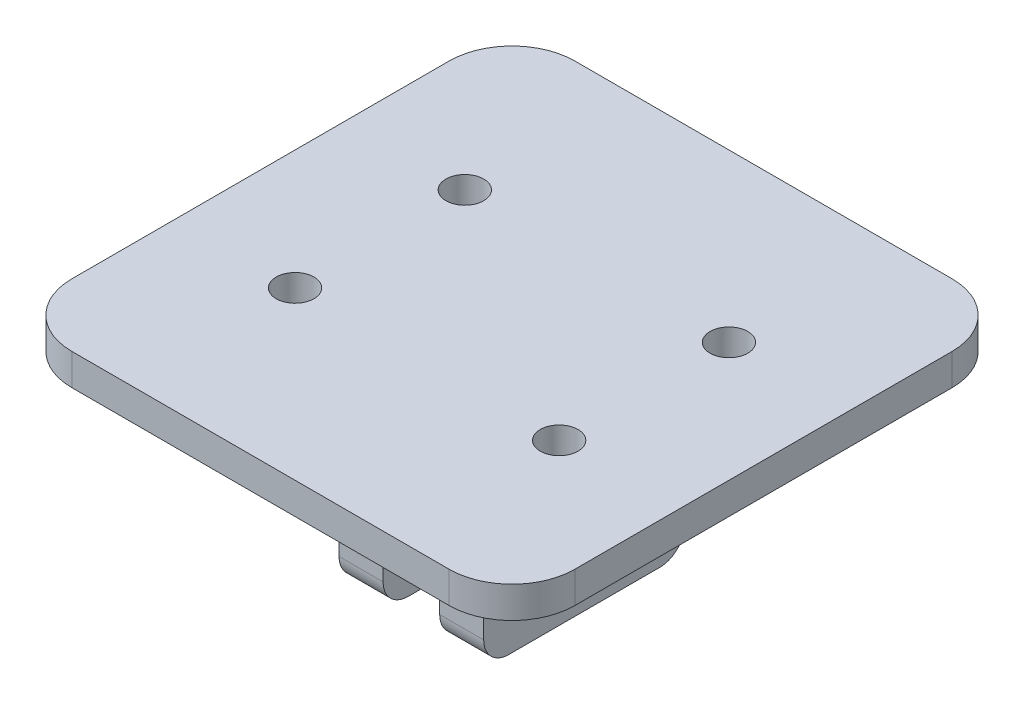
ISO-10303-21;
HEADER;
FILE_DESCRIPTION(('STEP AP214'),'2;1');
FILE_NAME('part.step','',(''),(''),'','','');
FILE_SCHEMA(('AUTOMOTIVE_DESIGN { 1 0 10303 214 1 1 1 1 }'));
ENDSEC;
DATA;
#1=APPLICATION_CONTEXT('core data for automotive mechanical design processes');
#2=APPLICATION_PROTOCOL_DEFINITION('international standard','automotive_design',2000,#1);
#3=PRODUCT_CONTEXT('',#1,'mechanical');
#4=PRODUCT('Part','Part','',(#3));
#5=PRODUCT_RELATED_PRODUCT_CATEGORY('part','',(#4));
#6=PRODUCT_DEFINITION_FORMATION('','',#4);
#7=PRODUCT_DEFINITION_CONTEXT('part definition',#1,'design');
#8=PRODUCT_DEFINITION('design','',#6,#7);
#9=PRODUCT_DEFINITION_SHAPE('','',#8);
#10=(LENGTH_UNIT() NAMED_UNIT(*) SI_UNIT(.MILLI.,.METRE.));
#11=(NAMED_UNIT(*) PLANE_ANGLE_UNIT() SI_UNIT($,.RADIAN.));
#12=(NAMED_UNIT(*) SI_UNIT($,.STERADIAN.) SOLID_ANGLE_UNIT());
#13=UNCERTAINTY_MEASURE_WITH_UNIT(LENGTH_MEASURE(1.E-05),#10,'distance_accuracy_value','');
#14=(GEOMETRIC_REPRESENTATION_CONTEXT(3) GLOBAL_UNCERTAINTY_ASSIGNED_CONTEXT((#13)) GLOBAL_UNIT_ASSIGNED_CONTEXT((#10,
#11,#12)) REPRESENTATION_CONTEXT('',''));
#15=CARTESIAN_POINT('',(0.,0.,0.));
#16=DIRECTION('',(0.,0.,1.));
#17=DIRECTION('',(1.,0.,0.));
#18=AXIS2_PLACEMENT_3D('',#15,#16,#17);
#19=CARTESIAN_POINT('',(0.,0.,0.));
#20=DIRECTION('',(0.,1.,0.));
#21=DIRECTION('',(0.,0.,1.));
#22=AXIS2_PLACEMENT_3D('',#19,#20,#21);
#23=PLANE('',#22);
#24=DIRECTION('',(0.,0.,-1.));
#25=VECTOR('',#24,1.);
#26=CARTESIAN_POINT('',(2.25,0.,8.));
#27=LINE('',#26,#25);
#28=CARTESIAN_POINT('',(2.25,0.,8.));
#29=VERTEX_POINT('',#28);
#30=CARTESIAN_POINT('',(2.25,0.,-8.00000000000001));
#31=VERTEX_POINT('',#30);
#32=EDGE_CURVE('E195',#29,#31,#27,.T.);
#33=ORIENTED_EDGE('',*,*,#32,.F.);
#34=DIRECTION('',(-1.,0.,0.));
#35=VECTOR('',#34,1.);
#36=CARTESIAN_POINT('',(2.25,0.,8.));
#37=LINE('',#36,#35);
#38=CARTESIAN_POINT('',(5.75,0.,7.99999999999999));
#39=VERTEX_POINT('',#38);
#40=EDGE_CURVE('E222',#39,#29,#37,.T.);
#41=ORIENTED_EDGE('',*,*,#40,.F.);
#42=DIRECTION('',(0.,0.,1.));
#43=VECTOR('',#42,1.);
#44=CARTESIAN_POINT('',(5.75,0.,7.99999999999999));
#45=LINE('',#44,#43);
#46=CARTESIAN_POINT('',(5.75,0.,-8.00000000000001));
#47=VERTEX_POINT('',#46);
#48=EDGE_CURVE('E225',#47,#39,#45,.T.);
#49=ORIENTED_EDGE('',*,*,#48,.F.);
#50=DIRECTION('',(1.,0.,0.));
#51=VECTOR('',#50,1.);
#52=CARTESIAN_POINT('',(2.25,0.,-8.00000000000001));
#53=LINE('',#52,#51);
#54=EDGE_CURVE('E229',#31,#47,#53,.T.);
#55=ORIENTED_EDGE('',*,*,#54,.F.);
#56=EDGE_LOOP('',(#33,#41,#49,#55));
#57=FACE_BOUND('',#56,.T.);
#58=CARTESIAN_POINT('',(10.5,0.,-6.75));
#59=DIRECTION('',(0.,1.,0.));
#60=DIRECTION('',(0.,0.,1.));
#61=AXIS2_PLACEMENT_3D('',#58,#59,#60);
#62=CIRCLE('',#61,1.5);
#63=CARTESIAN_POINT('',(10.5,0.,-5.25));
#64=VERTEX_POINT('',#63);
#65=EDGE_CURVE('E211',#64,#64,#62,.T.);
#66=ORIENTED_EDGE('',*,*,#65,.T.);
#67=EDGE_LOOP('',(#66));
#68=FACE_BOUND('',#67,.T.);
#69=CARTESIAN_POINT('',(-10.5,0.,-6.75));
#70=DIRECTION('',(0.,1.,0.));
#71=DIRECTION('',(0.,0.,1.));
#72=AXIS2_PLACEMENT_3D('',#69,#70,#71);
#73=CIRCLE('',#72,1.5);
#74=CARTESIAN_POINT('',(-10.5,0.,-5.25));
#75=VERTEX_POINT('',#74);
#76=EDGE_CURVE('E276',#75,#75,#73,.T.);
#77=ORIENTED_EDGE('',*,*,#76,.T.);
#78=EDGE_LOOP('',(#77));
#79=FACE_BOUND('',#78,.T.);
#80=CARTESIAN_POINT('',(-10.5,0.,6.74999999999999));
#81=DIRECTION('',(0.,1.,0.));
#82=DIRECTION('',(0.,0.,1.));
#83=AXIS2_PLACEMENT_3D('',#80,#81,#82);
#84=CIRCLE('',#83,1.5);
#85=CARTESIAN_POINT('',(-10.5,0.,8.24999999999999));
#86=VERTEX_POINT('',#85);
#87=EDGE_CURVE('E279',#86,#86,#84,.T.);
#88=ORIENTED_EDGE('',*,*,#87,.T.);
#89=EDGE_LOOP('',(#88));
#90=FACE_BOUND('',#89,.T.);
#91=CARTESIAN_POINT('',(10.5,0.,6.75));
#92=DIRECTION('',(0.,1.,0.));
#93=DIRECTION('',(0.,0.,1.));
#94=AXIS2_PLACEMENT_3D('',#91,#92,#93);
#95=CIRCLE('',#94,1.5);
#96=CARTESIAN_POINT('',(10.5,0.,8.25));
#97=VERTEX_POINT('',#96);
#98=EDGE_CURVE('E282',#97,#97,#95,.T.);
#99=ORIENTED_EDGE('',*,*,#98,.T.);
#100=EDGE_LOOP('',(#99));
#101=FACE_BOUND('',#100,.T.);
#102=DIRECTION('',(-1.,0.,0.));
#103=VECTOR('',#102,1.);
#104=CARTESIAN_POINT('',(0.,0.,-20.));
#105=LINE('',#104,#103);
#106=CARTESIAN_POINT('',(15.,0.,-20.));
#107=VERTEX_POINT('',#106);
#108=CARTESIAN_POINT('',(-15.,0.,-20.));
#109=VERTEX_POINT('',#108);
#110=EDGE_CURVE('E285',#107,#109,#105,.T.);
#111=ORIENTED_EDGE('',*,*,#110,.F.);
#112=CARTESIAN_POINT('',(15.,0.,-15.));
#113=DIRECTION('',(0.,1.,0.));
#114=DIRECTION('',(0.,0.,1.));
#115=AXIS2_PLACEMENT_3D('',#112,#113,#114);
#116=CIRCLE('',#115,5.);
#117=CARTESIAN_POINT('',(20.,0.,-15.));
#118=VERTEX_POINT('',#117);
#119=EDGE_CURVE('E242',#107,#118,#116,.F.);
#120=ORIENTED_EDGE('',*,*,#119,.T.);
#121=DIRECTION('',(0.,0.,1.));
#122=VECTOR('',#121,1.);
#123=CARTESIAN_POINT('',(20.,0.,0.));
#124=LINE('',#123,#122);
#125=CARTESIAN_POINT('',(20.,0.,15.));
#126=VERTEX_POINT('',#125);
#127=EDGE_CURVE('E302',#118,#126,#124,.T.);
#128=ORIENTED_EDGE('',*,*,#127,.T.);
#129=CARTESIAN_POINT('',(15.,0.,15.));
#130=DIRECTION('',(0.,1.,0.));
#131=DIRECTION('',(0.,0.,1.));
#132=AXIS2_PLACEMENT_3D('',#129,#130,#131);
#133=CIRCLE('',#132,5.);
#134=CARTESIAN_POINT('',(15.,0.,20.));
#135=VERTEX_POINT('',#134);
#136=EDGE_CURVE('E299',#126,#135,#133,.F.);
#137=ORIENTED_EDGE('',*,*,#136,.T.);
#138=DIRECTION('',(-1.,0.,0.));
#139=VECTOR('',#138,1.);
#140=CARTESIAN_POINT('',(0.,0.,20.));
#141=LINE('',#140,#139);
#142=CARTESIAN_POINT('',(-15.,0.,20.));
#143=VERTEX_POINT('',#142);
#144=EDGE_CURVE('E296',#135,#143,#141,.T.);
#145=ORIENTED_EDGE('',*,*,#144,.T.);
#146=CARTESIAN_POINT('',(-15.,0.,15.));
#147=DIRECTION('',(0.,1.,0.));
#148=DIRECTION('',(0.,0.,1.));
#149=AXIS2_PLACEMENT_3D('',#146,#147,#148);
#150=CIRCLE('',#149,5.);
#151=CARTESIAN_POINT('',(-20.,0.,15.));
#152=VERTEX_POINT('',#151);
#153=EDGE_CURVE('E293',#143,#152,#150,.F.);
#154=ORIENTED_EDGE('',*,*,#153,.T.);
#155=DIRECTION('',(0.,0.,1.));
#156=VECTOR('',#155,1.);
#157=CARTESIAN_POINT('',(-20.,0.,0.));
#158=LINE('',#157,#156);
#159=CARTESIAN_POINT('',(-20.,0.,-15.));
#160=VERTEX_POINT('',#159);
#161=EDGE_CURVE('E290',#160,#152,#158,.T.);
#162=ORIENTED_EDGE('',*,*,#161,.F.);
#163=CARTESIAN_POINT('',(-15.,0.,-15.));
#164=DIRECTION('',(0.,1.,0.));
#165=DIRECTION('',(0.,0.,1.));
#166=AXIS2_PLACEMENT_3D('',#163,#164,#165);
#167=CIRCLE('',#166,5.);
#168=EDGE_CURVE('E288',#109,#160,#167,.T.);
#169=ORIENTED_EDGE('',*,*,#168,.F.);
#170=EDGE_LOOP('',(#111,#120,#128,#137,#145,#154,#162,#169));
#171=FACE_BOUND('',#170,.T.);
#172=DIRECTION('',(0.,0.,-1.));
#173=VECTOR('',#172,1.);
#174=CARTESIAN_POINT('',(-5.75,0.,7.99999999999999));
#175=LINE('',#174,#173);
#176=CARTESIAN_POINT('',(-5.75,0.,7.99999999999999));
#177=VERTEX_POINT('',#176);
#178=CARTESIAN_POINT('',(-5.75,0.,-8.00000000000001));
#179=VERTEX_POINT('',#178);
#180=EDGE_CURVE('E181',#177,#179,#175,.T.);
#181=ORIENTED_EDGE('',*,*,#180,.F.);
#182=DIRECTION('',(-1.,0.,0.));
#183=VECTOR('',#182,1.);
#184=CARTESIAN_POINT('',(-2.25,0.,8.));
#185=LINE('',#184,#183);
#186=CARTESIAN_POINT('',(-2.25,0.,8.));
#187=VERTEX_POINT('',#186);
#188=EDGE_CURVE('E191',#187,#177,#185,.T.);
#189=ORIENTED_EDGE('',*,*,#188,.F.);
#190=DIRECTION('',(0.,0.,1.));
#191=VECTOR('',#190,1.);
#192=CARTESIAN_POINT('',(-2.25,0.,8.));
#193=LINE('',#192,#191);
#194=CARTESIAN_POINT('',(-2.25,0.,-8.00000000000001));
#195=VERTEX_POINT('',#194);
#196=EDGE_CURVE('E199',#195,#187,#193,.T.);
#197=ORIENTED_EDGE('',*,*,#196,.F.);
#198=DIRECTION('',(1.,0.,0.));
#199=VECTOR('',#198,1.);
#200=CARTESIAN_POINT('',(-2.25,0.,-8.00000000000001));
#201=LINE('',#200,#199);
#202=EDGE_CURVE('E194',#179,#195,#201,.T.);
#203=ORIENTED_EDGE('',*,*,#202,.F.);
#204=EDGE_LOOP('',(#181,#189,#197,#203));
#205=FACE_BOUND('',#204,.T.);
#206=ADVANCED_FACE('F39',(#57,#68,#79,#90,#101,#171,#205),#23,.F.);
#207=CARTESIAN_POINT('',(0.,2.5,-20.));
#208=DIRECTION('',(0.,0.,1.));
#209=DIRECTION('',(1.,0.,0.));
#210=AXIS2_PLACEMENT_3D('',#207,#208,#209);
#211=PLANE('',#210);
#212=ORIENTED_EDGE('',*,*,#110,.T.);
#213=DIRECTION('',(0.,-1.,0.));
#214=VECTOR('',#213,1.);
#215=CARTESIAN_POINT('',(-15.,2.5,-20.));
#216=LINE('',#215,#214);
#217=CARTESIAN_POINT('',(-15.,2.5,-20.));
#218=VERTEX_POINT('',#217);
#219=EDGE_CURVE('E321',#218,#109,#216,.T.);
#220=ORIENTED_EDGE('',*,*,#219,.F.);
#221=DIRECTION('',(-1.,0.,0.));
#222=VECTOR('',#221,1.);
#223=CARTESIAN_POINT('',(0.,2.5,-20.));
#224=LINE('',#223,#222);
#225=CARTESIAN_POINT('',(15.,2.5,-20.));
#226=VERTEX_POINT('',#225);
#227=EDGE_CURVE('E251',#226,#218,#224,.T.);
#228=ORIENTED_EDGE('',*,*,#227,.F.);
#229=DIRECTION('',(0.,-1.,0.));
#230=VECTOR('',#229,1.);
#231=CARTESIAN_POINT('',(15.,2.5,-20.));
#232=LINE('',#231,#230);
#233=EDGE_CURVE('E273',#226,#107,#232,.T.);
#234=ORIENTED_EDGE('',*,*,#233,.T.);
#235=EDGE_LOOP('',(#212,#220,#228,#234));
#236=FACE_BOUND('',#235,.T.);
#237=ADVANCED_FACE('F386',(#236),#211,.F.);
#238=CARTESIAN_POINT('',(-15.,2.5,-15.));
#239=DIRECTION('',(0.,-1.,0.));
#240=DIRECTION('',(0.,0.,-1.));
#241=AXIS2_PLACEMENT_3D('',#238,#239,#240);
#242=CYLINDRICAL_SURFACE('',#241,5.);
#243=ORIENTED_EDGE('',*,*,#168,.T.);
#244=DIRECTION('',(0.,-1.,0.));
#245=VECTOR('',#244,1.);
#246=CARTESIAN_POINT('',(-20.,2.5,-15.));
#247=LINE('',#246,#245);
#248=CARTESIAN_POINT('',(-20.,2.5,-15.));
#249=VERTEX_POINT('',#248);
#250=EDGE_CURVE('E318',#249,#160,#247,.T.);
#251=ORIENTED_EDGE('',*,*,#250,.F.);
#252=CARTESIAN_POINT('',(-15.,2.5,-15.));
#253=DIRECTION('',(0.,1.,0.));
#254=DIRECTION('',(0.,0.,1.));
#255=AXIS2_PLACEMENT_3D('',#252,#253,#254);
#256=CIRCLE('',#255,5.);
#257=EDGE_CURVE('E254',#218,#249,#256,.T.);
#258=ORIENTED_EDGE('',*,*,#257,.F.);
#259=ORIENTED_EDGE('',*,*,#219,.T.);
#260=EDGE_LOOP('',(#243,#251,#258,#259));
#261=FACE_BOUND('',#260,.T.);
#262=ADVANCED_FACE('F427',(#261),#242,.T.);
#263=CARTESIAN_POINT('',(-20.,2.5,0.));
#264=DIRECTION('',(1.,0.,0.));
#265=DIRECTION('',(0.,0.,-1.));
#266=AXIS2_PLACEMENT_3D('',#263,#264,#265);
#267=PLANE('',#266);
#268=ORIENTED_EDGE('',*,*,#161,.T.);
#269=DIRECTION('',(0.,-1.,0.));
#270=VECTOR('',#269,1.);
#271=CARTESIAN_POINT('',(-20.,2.5,15.));
#272=LINE('',#271,#270);
#273=CARTESIAN_POINT('',(-20.,2.5,15.));
#274=VERTEX_POINT('',#273);
#275=EDGE_CURVE('E316',#274,#152,#272,.T.);
#276=ORIENTED_EDGE('',*,*,#275,.F.);
#277=DIRECTION('',(0.,0.,1.));
#278=VECTOR('',#277,1.);
#279=CARTESIAN_POINT('',(-20.,2.5,0.));
#280=LINE('',#279,#278);
#281=EDGE_CURVE('E256',#249,#274,#280,.T.);
#282=ORIENTED_EDGE('',*,*,#281,.F.);
#283=ORIENTED_EDGE('',*,*,#250,.T.);
#284=EDGE_LOOP('',(#268,#276,#282,#283));
#285=FACE_BOUND('',#284,.T.);
#286=ADVANCED_FACE('F423',(#285),#267,.F.);
#287=CARTESIAN_POINT('',(-15.,2.5,15.));
#288=DIRECTION('',(0.,-1.,0.));
#289=DIRECTION('',(0.,0.,-1.));
#290=AXIS2_PLACEMENT_3D('',#287,#288,#289);
#291=CYLINDRICAL_SURFACE('',#290,5.);
#292=ORIENTED_EDGE('',*,*,#153,.F.);
#293=DIRECTION('',(0.,-1.,0.));
#294=VECTOR('',#293,1.);
#295=CARTESIAN_POINT('',(-15.,2.5,20.));
#296=LINE('',#295,#294);
#297=CARTESIAN_POINT('',(-15.,2.5,20.));
#298=VERTEX_POINT('',#297);
#299=EDGE_CURVE('E314',#298,#143,#296,.T.);
#300=ORIENTED_EDGE('',*,*,#299,.F.);
#301=CARTESIAN_POINT('',(-15.,2.5,15.));
#302=DIRECTION('',(0.,1.,0.));
#303=DIRECTION('',(0.,0.,1.));
#304=AXIS2_PLACEMENT_3D('',#301,#302,#303);
#305=CIRCLE('',#304,5.);
#306=EDGE_CURVE('E258',#298,#274,#305,.F.);
#307=ORIENTED_EDGE('',*,*,#306,.T.);
#308=ORIENTED_EDGE('',*,*,#275,.T.);
#309=EDGE_LOOP('',(#292,#300,#307,#308));
#310=FACE_BOUND('',#309,.T.);
#311=ADVANCED_FACE('F420',(#310),#291,.T.);
#312=CARTESIAN_POINT('',(0.,2.5,20.));
#313=DIRECTION('',(0.,0.,1.));
#314=DIRECTION('',(1.,0.,0.));
#315=AXIS2_PLACEMENT_3D('',#312,#313,#314);
#316=PLANE('',#315);
#317=ORIENTED_EDGE('',*,*,#144,.F.);
#318=DIRECTION('',(0.,-1.,0.));
#319=VECTOR('',#318,1.);
#320=CARTESIAN_POINT('',(15.,2.5,20.));
#321=LINE('',#320,#319);
#322=CARTESIAN_POINT('',(15.,2.5,20.));
#323=VERTEX_POINT('',#322);
#324=EDGE_CURVE('E312',#323,#135,#321,.T.);
#325=ORIENTED_EDGE('',*,*,#324,.F.);
#326=DIRECTION('',(-1.,0.,0.));
#327=VECTOR('',#326,1.);
#328=CARTESIAN_POINT('',(0.,2.5,20.));
#329=LINE('',#328,#327);
#330=EDGE_CURVE('E261',#323,#298,#329,.T.);
#331=ORIENTED_EDGE('',*,*,#330,.T.);
#332=ORIENTED_EDGE('',*,*,#299,.T.);
#333=EDGE_LOOP('',(#317,#325,#331,#332));
#334=FACE_BOUND('',#333,.T.);
#335=ADVANCED_FACE('F416',(#334),#316,.T.);
#336=CARTESIAN_POINT('',(15.,2.5,15.));
#337=DIRECTION('',(0.,-1.,0.));
#338=DIRECTION('',(0.,0.,-1.));
#339=AXIS2_PLACEMENT_3D('',#336,#337,#338);
#340=CYLINDRICAL_SURFACE('',#339,5.);
#341=ORIENTED_EDGE('',*,*,#136,.F.);
#342=DIRECTION('',(0.,-1.,0.));
#343=VECTOR('',#342,1.);
#344=CARTESIAN_POINT('',(20.,2.5,15.));
#345=LINE('',#344,#343);
#346=CARTESIAN_POINT('',(20.,2.5,15.));
#347=VERTEX_POINT('',#346);
#348=EDGE_CURVE('E310',#347,#126,#345,.T.);
#349=ORIENTED_EDGE('',*,*,#348,.F.);
#350=CARTESIAN_POINT('',(15.,2.5,15.));
#351=DIRECTION('',(0.,1.,0.));
#352=DIRECTION('',(0.,0.,1.));
#353=AXIS2_PLACEMENT_3D('',#350,#351,#352);
#354=CIRCLE('',#353,5.);
#355=EDGE_CURVE('E264',#347,#323,#354,.F.);
#356=ORIENTED_EDGE('',*,*,#355,.T.);
#357=ORIENTED_EDGE('',*,*,#324,.T.);
#358=EDGE_LOOP('',(#341,#349,#356,#357));
#359=FACE_BOUND('',#358,.T.);
#360=ADVANCED_FACE('F412',(#359),#340,.T.);
#361=CARTESIAN_POINT('',(20.,2.5,0.));
#362=DIRECTION('',(1.,0.,0.));
#363=DIRECTION('',(0.,0.,-1.));
#364=AXIS2_PLACEMENT_3D('',#361,#362,#363);
#365=PLANE('',#364);
#366=ORIENTED_EDGE('',*,*,#127,.F.);
#367=DIRECTION('',(0.,-1.,0.));
#368=VECTOR('',#367,1.);
#369=CARTESIAN_POINT('',(20.,2.5,-15.));
#370=LINE('',#369,#368);
#371=CARTESIAN_POINT('',(20.,2.5,-15.));
#372=VERTEX_POINT('',#371);
#373=EDGE_CURVE('E308',#372,#118,#370,.T.);
#374=ORIENTED_EDGE('',*,*,#373,.F.);
#375=DIRECTION('',(0.,0.,1.));
#376=VECTOR('',#375,1.);
#377=CARTESIAN_POINT('',(20.,2.5,0.));
#378=LINE('',#377,#376);
#379=EDGE_CURVE('E267',#372,#347,#378,.T.);
#380=ORIENTED_EDGE('',*,*,#379,.T.);
#381=ORIENTED_EDGE('',*,*,#348,.T.);
#382=EDGE_LOOP('',(#366,#374,#380,#381));
#383=FACE_BOUND('',#382,.T.);
#384=ADVANCED_FACE('F408',(#383),#365,.T.);
#385=CARTESIAN_POINT('',(10.5,2.5,6.75));
#386=DIRECTION('',(0.,-1.,0.));
#387=DIRECTION('',(0.,0.,-1.));
#388=AXIS2_PLACEMENT_3D('',#385,#386,#387);
#389=CYLINDRICAL_SURFACE('',#388,1.5);
#390=CARTESIAN_POINT('',(10.5,2.5,6.75));
#391=DIRECTION('',(0.,1.,0.));
#392=DIRECTION('',(0.,0.,1.));
#393=AXIS2_PLACEMENT_3D('',#390,#391,#392);
#394=CIRCLE('',#393,1.5);
#395=CARTESIAN_POINT('',(10.5,2.5,8.25));
#396=VERTEX_POINT('',#395);
#397=EDGE_CURVE('E248',#396,#396,#394,.T.);
#398=ORIENTED_EDGE('',*,*,#397,.T.);
#399=EDGE_LOOP('',(#398));
#400=FACE_BOUND('',#399,.T.);
#401=ORIENTED_EDGE('',*,*,#98,.F.);
#402=EDGE_LOOP('',(#401));
#403=FACE_BOUND('',#402,.T.);
#404=ADVANCED_FACE('F448',(#400,#403),#389,.F.);
#405=CARTESIAN_POINT('',(-10.5,2.5,6.74999999999999));
#406=DIRECTION('',(0.,-1.,0.));
#407=DIRECTION('',(0.,0.,-1.));
#408=AXIS2_PLACEMENT_3D('',#405,#406,#407);
#409=CYLINDRICAL_SURFACE('',#408,1.5);
#410=CARTESIAN_POINT('',(-10.5,2.5,6.74999999999999));
#411=DIRECTION('',(0.,1.,0.));
#412=DIRECTION('',(0.,0.,1.));
#413=AXIS2_PLACEMENT_3D('',#410,#411,#412);
#414=CIRCLE('',#413,1.5);
#415=CARTESIAN_POINT('',(-10.5,2.5,8.24999999999999));
#416=VERTEX_POINT('',#415);
#417=EDGE_CURVE('E245',#416,#416,#414,.T.);
#418=ORIENTED_EDGE('',*,*,#417,.T.);
#419=EDGE_LOOP('',(#418));
#420=FACE_BOUND('',#419,.T.);
#421=ORIENTED_EDGE('',*,*,#87,.F.);
#422=EDGE_LOOP('',(#421));
#423=FACE_BOUND('',#422,.T.);
#424=ADVANCED_FACE('F463',(#420,#423),#409,.F.);
#425=CARTESIAN_POINT('',(-10.5,2.5,-6.75));
#426=DIRECTION('',(0.,-1.,0.));
#427=DIRECTION('',(0.,0.,-1.));
#428=AXIS2_PLACEMENT_3D('',#425,#426,#427);
#429=CYLINDRICAL_SURFACE('',#428,1.5);
#430=CARTESIAN_POINT('',(-10.5,2.5,-6.75));
#431=DIRECTION('',(0.,1.,0.));
#432=DIRECTION('',(0.,0.,1.));
#433=AXIS2_PLACEMENT_3D('',#430,#431,#432);
#434=CIRCLE('',#433,1.5);
#435=CARTESIAN_POINT('',(-10.5,2.5,-5.25));
#436=VERTEX_POINT('',#435);
#437=EDGE_CURVE('E241',#436,#436,#434,.T.);
#438=ORIENTED_EDGE('',*,*,#437,.T.);
#439=EDGE_LOOP('',(#438));
#440=FACE_BOUND('',#439,.T.);
#441=ORIENTED_EDGE('',*,*,#76,.F.);
#442=EDGE_LOOP('',(#441));
#443=FACE_BOUND('',#442,.T.);
#444=ADVANCED_FACE('F467',(#440,#443),#429,.F.);
#445=CARTESIAN_POINT('',(10.5,2.5,-6.75));
#446=DIRECTION('',(0.,-1.,0.));
#447=DIRECTION('',(0.,0.,-1.));
#448=AXIS2_PLACEMENT_3D('',#445,#446,#447);
#449=CYLINDRICAL_SURFACE('',#448,1.5);
#450=CARTESIAN_POINT('',(10.5,2.5,-6.75));
#451=DIRECTION('',(0.,1.,0.));
#452=DIRECTION('',(0.,0.,1.));
#453=AXIS2_PLACEMENT_3D('',#450,#451,#452);
#454=CIRCLE('',#453,1.5);
#455=CARTESIAN_POINT('',(10.5,2.5,-5.25));
#456=VERTEX_POINT('',#455);
#457=EDGE_CURVE('E238',#456,#456,#454,.T.);
#458=ORIENTED_EDGE('',*,*,#457,.T.);
#459=EDGE_LOOP('',(#458));
#460=FACE_BOUND('',#459,.T.);
#461=ORIENTED_EDGE('',*,*,#65,.F.);
#462=EDGE_LOOP('',(#461));
#463=FACE_BOUND('',#462,.T.);
#464=ADVANCED_FACE('F439',(#460,#463),#449,.F.);
#465=CARTESIAN_POINT('',(15.,2.5,-15.));
#466=DIRECTION('',(0.,-1.,0.));
#467=DIRECTION('',(0.,0.,-1.));
#468=AXIS2_PLACEMENT_3D('',#465,#466,#467);
#469=CYLINDRICAL_SURFACE('',#468,5.);
#470=ORIENTED_EDGE('',*,*,#119,.F.);
#471=ORIENTED_EDGE('',*,*,#233,.F.);
#472=CARTESIAN_POINT('',(15.,2.5,-15.));
#473=DIRECTION('',(0.,1.,0.));
#474=DIRECTION('',(0.,0.,1.));
#475=AXIS2_PLACEMENT_3D('',#472,#473,#474);
#476=CIRCLE('',#475,5.);
#477=EDGE_CURVE('E270',#226,#372,#476,.F.);
#478=ORIENTED_EDGE('',*,*,#477,.T.);
#479=ORIENTED_EDGE('',*,*,#373,.T.);
#480=EDGE_LOOP('',(#470,#471,#478,#479));
#481=FACE_BOUND('',#480,.T.);
#482=ADVANCED_FACE('F402',(#481),#469,.T.);
#483=CARTESIAN_POINT('',(0.,2.5,0.));
#484=DIRECTION('',(0.,1.,0.));
#485=DIRECTION('',(0.,0.,1.));
#486=AXIS2_PLACEMENT_3D('',#483,#484,#485);
#487=PLANE('',#486);
#488=ORIENTED_EDGE('',*,*,#457,.F.);
#489=EDGE_LOOP('',(#488));
#490=FACE_BOUND('',#489,.T.);
#491=ORIENTED_EDGE('',*,*,#437,.F.);
#492=EDGE_LOOP('',(#491));
#493=FACE_BOUND('',#492,.T.);
#494=ORIENTED_EDGE('',*,*,#417,.F.);
#495=EDGE_LOOP('',(#494));
#496=FACE_BOUND('',#495,.T.);
#497=ORIENTED_EDGE('',*,*,#397,.F.);
#498=EDGE_LOOP('',(#497));
#499=FACE_BOUND('',#498,.T.);
#500=ORIENTED_EDGE('',*,*,#227,.T.);
#501=ORIENTED_EDGE('',*,*,#257,.T.);
#502=ORIENTED_EDGE('',*,*,#281,.T.);
#503=ORIENTED_EDGE('',*,*,#306,.F.);
#504=ORIENTED_EDGE('',*,*,#330,.F.);
#505=ORIENTED_EDGE('',*,*,#355,.F.);
#506=ORIENTED_EDGE('',*,*,#379,.F.);
#507=ORIENTED_EDGE('',*,*,#477,.F.);
#508=EDGE_LOOP('',(#500,#501,#502,#503,#504,#505,#506,#507));
#509=FACE_BOUND('',#508,.T.);
#510=ADVANCED_FACE('F429',(#490,#493,#496,#499,#509),#487,.T.);
#511=CARTESIAN_POINT('',(2.25,-15.,8.));
#512=DIRECTION('',(1.,0.,0.));
#513=DIRECTION('',(0.,0.,-1.));
#514=AXIS2_PLACEMENT_3D('',#511,#512,#513);
#515=PLANE('',#514);
#516=CARTESIAN_POINT('',(2.25,-10.,0.));
#517=DIRECTION('',(1.,0.,0.));
#518=DIRECTION('',(0.,0.,-1.));
#519=AXIS2_PLACEMENT_3D('',#516,#517,#518);
#520=CIRCLE('',#519,3.);
#521=CARTESIAN_POINT('',(2.25,-10.,-3.));
#522=VERTEX_POINT('',#521);
#523=EDGE_CURVE('E215',#522,#522,#520,.T.);
#524=ORIENTED_EDGE('',*,*,#523,.T.);
#525=EDGE_LOOP('',(#524));
#526=FACE_BOUND('',#525,.T.);
#527=DIRECTION('',(0.,0.,-1.));
#528=VECTOR('',#527,1.);
#529=CARTESIAN_POINT('',(2.25,-15.,8.));
#530=LINE('',#529,#528);
#531=CARTESIAN_POINT('',(2.25,-15.,6.));
#532=VERTEX_POINT('',#531);
#533=CARTESIAN_POINT('',(2.25,-15.,-6.00000000000001));
#534=VERTEX_POINT('',#533);
#535=EDGE_CURVE('E226',#532,#534,#530,.T.);
#536=ORIENTED_EDGE('',*,*,#535,.F.);
#537=CARTESIAN_POINT('',(2.25,-13.,6.));
#538=DIRECTION('',(1.,0.,0.));
#539=DIRECTION('',(0.,0.,-1.));
#540=AXIS2_PLACEMENT_3D('',#537,#538,#539);
#541=CIRCLE('',#540,2.);
#542=CARTESIAN_POINT('',(2.25,-13.,8.));
#543=VERTEX_POINT('',#542);
#544=EDGE_CURVE('E332',#532,#543,#541,.F.);
#545=ORIENTED_EDGE('',*,*,#544,.T.);
#546=DIRECTION('',(0.,1.,0.));
#547=VECTOR('',#546,1.);
#548=CARTESIAN_POINT('',(2.25,-15.,8.));
#549=LINE('',#548,#547);
#550=EDGE_CURVE('E219',#543,#29,#549,.T.);
#551=ORIENTED_EDGE('',*,*,#550,.T.);
#552=ORIENTED_EDGE('',*,*,#32,.T.);
#553=DIRECTION('',(0.,1.,0.));
#554=VECTOR('',#553,1.);
#555=CARTESIAN_POINT('',(2.25,-15.,-8.00000000000001));
#556=LINE('',#555,#554);
#557=CARTESIAN_POINT('',(2.25,-13.,-8.00000000000001));
#558=VERTEX_POINT('',#557);
#559=EDGE_CURVE('E212',#558,#31,#556,.T.);
#560=ORIENTED_EDGE('',*,*,#559,.F.);
#561=CARTESIAN_POINT('',(2.25,-13.,-6.00000000000001));
#562=DIRECTION('',(1.,0.,0.));
#563=DIRECTION('',(0.,0.,-1.));
#564=AXIS2_PLACEMENT_3D('',#561,#562,#563);
#565=CIRCLE('',#564,2.);
#566=EDGE_CURVE('E330',#558,#534,#565,.F.);
#567=ORIENTED_EDGE('',*,*,#566,.T.);
#568=EDGE_LOOP('',(#536,#545,#551,#552,#560,#567));
#569=FACE_BOUND('',#568,.T.);
#570=ADVANCED_FACE('F363',(#526,#569),#515,.F.);
#571=CARTESIAN_POINT('',(2.25,-15.,-8.00000000000001));
#572=DIRECTION('',(0.,0.,1.));
#573=DIRECTION('',(1.,0.,0.));
#574=AXIS2_PLACEMENT_3D('',#571,#572,#573);
#575=PLANE('',#574);
#576=DIRECTION('',(0.,1.,0.));
#577=VECTOR('',#576,1.);
#578=CARTESIAN_POINT('',(5.75,-15.,-8.00000000000001));
#579=LINE('',#578,#577);
#580=CARTESIAN_POINT('',(5.75,-13.,-8.00000000000001));
#581=VERTEX_POINT('',#580);
#582=EDGE_CURVE('E214',#581,#47,#579,.T.);
#583=ORIENTED_EDGE('',*,*,#582,.F.);
#584=DIRECTION('',(1.,0.,0.));
#585=VECTOR('',#584,1.);
#586=CARTESIAN_POINT('',(2.25,-13.,-8.00000000000001));
#587=LINE('',#586,#585);
#588=EDGE_CURVE('E48',#581,#558,#587,.F.);
#589=ORIENTED_EDGE('',*,*,#588,.T.);
#590=ORIENTED_EDGE('',*,*,#559,.T.);
#591=ORIENTED_EDGE('',*,*,#54,.T.);
#592=EDGE_LOOP('',(#583,#589,#590,#591));
#593=FACE_BOUND('',#592,.T.);
#594=ADVANCED_FACE('F357',(#593),#575,.F.);
#595=CARTESIAN_POINT('',(5.75,-15.,7.99999999999999));
#596=DIRECTION('',(-1.,0.,0.));
#597=DIRECTION('',(0.,0.,1.));
#598=AXIS2_PLACEMENT_3D('',#595,#596,#597);
#599=PLANE('',#598);
#600=CARTESIAN_POINT('',(5.75,-10.,0.));
#601=DIRECTION('',(-1.,0.,0.));
#602=DIRECTION('',(0.,0.,1.));
#603=AXIS2_PLACEMENT_3D('',#600,#601,#602);
#604=CIRCLE('',#603,3.);
#605=CARTESIAN_POINT('',(5.75,-10.,3.));
#606=VERTEX_POINT('',#605);
#607=EDGE_CURVE('E507',#606,#606,#604,.T.);
#608=ORIENTED_EDGE('',*,*,#607,.T.);
#609=EDGE_LOOP('',(#608));
#610=FACE_BOUND('',#609,.T.);
#611=DIRECTION('',(0.,1.,0.));
#612=VECTOR('',#611,1.);
#613=CARTESIAN_POINT('',(5.75,-15.,7.99999999999999));
#614=LINE('',#613,#612);
#615=CARTESIAN_POINT('',(5.75,-13.,7.99999999999999));
#616=VERTEX_POINT('',#615);
#617=EDGE_CURVE('E217',#616,#39,#614,.T.);
#618=ORIENTED_EDGE('',*,*,#617,.F.);
#619=CARTESIAN_POINT('',(5.75,-13.,5.99999999999999));
#620=DIRECTION('',(-1.,0.,0.));
#621=DIRECTION('',(0.,0.,1.));
#622=AXIS2_PLACEMENT_3D('',#619,#620,#621);
#623=CIRCLE('',#622,2.);
#624=CARTESIAN_POINT('',(5.75,-15.,5.99999999999999));
#625=VERTEX_POINT('',#624);
#626=EDGE_CURVE('E338',#616,#625,#623,.F.);
#627=ORIENTED_EDGE('',*,*,#626,.T.);
#628=DIRECTION('',(0.,0.,1.));
#629=VECTOR('',#628,1.);
#630=CARTESIAN_POINT('',(5.75,-15.,7.99999999999999));
#631=LINE('',#630,#629);
#632=CARTESIAN_POINT('',(5.75,-15.,-6.00000000000001));
#633=VERTEX_POINT('',#632);
#634=EDGE_CURVE('E221',#633,#625,#631,.T.);
#635=ORIENTED_EDGE('',*,*,#634,.F.);
#636=CARTESIAN_POINT('',(5.75,-13.,-6.00000000000001));
#637=DIRECTION('',(-1.,0.,0.));
#638=DIRECTION('',(0.,0.,1.));
#639=AXIS2_PLACEMENT_3D('',#636,#637,#638);
#640=CIRCLE('',#639,2.);
#641=EDGE_CURVE('E336',#633,#581,#640,.F.);
#642=ORIENTED_EDGE('',*,*,#641,.T.);
#643=ORIENTED_EDGE('',*,*,#582,.T.);
#644=ORIENTED_EDGE('',*,*,#48,.T.);
#645=EDGE_LOOP('',(#618,#627,#635,#642,#643,#644));
#646=FACE_BOUND('',#645,.T.);
#647=ADVANCED_FACE('F373',(#610,#646),#599,.F.);
#648=CARTESIAN_POINT('',(2.25,-15.,8.));
#649=DIRECTION('',(0.,0.,-1.));
#650=DIRECTION('',(-1.,0.,0.));
#651=AXIS2_PLACEMENT_3D('',#648,#649,#650);
#652=PLANE('',#651);
#653=ORIENTED_EDGE('',*,*,#550,.F.);
#654=DIRECTION('',(-1.,0.,0.));
#655=VECTOR('',#654,1.);
#656=CARTESIAN_POINT('',(5.75,-13.,7.99999999999999));
#657=LINE('',#656,#655);
#658=EDGE_CURVE('E334',#543,#616,#657,.F.);
#659=ORIENTED_EDGE('',*,*,#658,.T.);
#660=ORIENTED_EDGE('',*,*,#617,.T.);
#661=ORIENTED_EDGE('',*,*,#40,.T.);
#662=EDGE_LOOP('',(#653,#659,#660,#661));
#663=FACE_BOUND('',#662,.T.);
#664=ADVANCED_FACE('F380',(#663),#652,.F.);
#665=CARTESIAN_POINT('',(0.,-15.,0.));
#666=DIRECTION('',(0.,-1.,0.));
#667=DIRECTION('',(0.,0.,-1.));
#668=AXIS2_PLACEMENT_3D('',#665,#666,#667);
#669=PLANE('',#668);
#670=ORIENTED_EDGE('',*,*,#634,.T.);
#671=DIRECTION('',(-1.,0.,0.));
#672=VECTOR('',#671,1.);
#673=CARTESIAN_POINT('',(2.25,-15.,6.));
#674=LINE('',#673,#672);
#675=EDGE_CURVE('E327',#625,#532,#674,.T.);
#676=ORIENTED_EDGE('',*,*,#675,.T.);
#677=ORIENTED_EDGE('',*,*,#535,.T.);
#678=DIRECTION('',(1.,0.,0.));
#679=VECTOR('',#678,1.);
#680=CARTESIAN_POINT('',(5.75,-15.,-6.00000000000001));
#681=LINE('',#680,#679);
#682=EDGE_CURVE('E324',#534,#633,#681,.T.);
#683=ORIENTED_EDGE('',*,*,#682,.T.);
#684=EDGE_LOOP('',(#670,#676,#677,#683));
#685=FACE_BOUND('',#684,.T.);
#686=ADVANCED_FACE('F369',(#685),#669,.T.);
#687=CARTESIAN_POINT('',(-5.75,-15.,7.99999999999999));
#688=DIRECTION('',(1.,0.,0.));
#689=DIRECTION('',(0.,0.,-1.));
#690=AXIS2_PLACEMENT_3D('',#687,#688,#689);
#691=PLANE('',#690);
#692=CARTESIAN_POINT('',(-5.75,-10.,0.));
#693=DIRECTION('',(1.,0.,0.));
#694=DIRECTION('',(0.,0.,-1.));
#695=AXIS2_PLACEMENT_3D('',#692,#693,#694);
#696=CIRCLE('',#695,3.);
#697=CARTESIAN_POINT('',(-5.75,-10.,-3.));
#698=VERTEX_POINT('',#697);
#699=EDGE_CURVE('E510',#698,#698,#696,.T.);
#700=ORIENTED_EDGE('',*,*,#699,.T.);
#701=EDGE_LOOP('',(#700));
#702=FACE_BOUND('',#701,.T.);
#703=DIRECTION('',(0.,0.,-1.));
#704=VECTOR('',#703,1.);
#705=CARTESIAN_POINT('',(-5.75,-15.,7.99999999999999));
#706=LINE('',#705,#704);
#707=CARTESIAN_POINT('',(-5.75,-15.,5.99999999999999));
#708=VERTEX_POINT('',#707);
#709=CARTESIAN_POINT('',(-5.75,-15.,-6.00000000000001));
#710=VERTEX_POINT('',#709);
#711=EDGE_CURVE('E198',#708,#710,#706,.T.);
#712=ORIENTED_EDGE('',*,*,#711,.F.);
#713=CARTESIAN_POINT('',(-5.75,-13.,5.99999999999999));
#714=DIRECTION('',(1.,0.,0.));
#715=DIRECTION('',(0.,0.,-1.));
#716=AXIS2_PLACEMENT_3D('',#713,#714,#715);
#717=CIRCLE('',#716,2.);
#718=CARTESIAN_POINT('',(-5.75,-13.,7.99999999999999));
#719=VERTEX_POINT('',#718);
#720=EDGE_CURVE('E182',#708,#719,#717,.F.);
#721=ORIENTED_EDGE('',*,*,#720,.T.);
#722=DIRECTION('',(0.,1.,0.));
#723=VECTOR('',#722,1.);
#724=CARTESIAN_POINT('',(-5.75,-15.,7.99999999999999));
#725=LINE('',#724,#723);
#726=EDGE_CURVE('E176',#719,#177,#725,.T.);
#727=ORIENTED_EDGE('',*,*,#726,.T.);
#728=ORIENTED_EDGE('',*,*,#180,.T.);
#729=DIRECTION('',(0.,1.,0.));
#730=VECTOR('',#729,1.);
#731=CARTESIAN_POINT('',(-5.75,-15.,-8.00000000000001));
#732=LINE('',#731,#730);
#733=CARTESIAN_POINT('',(-5.75,-13.,-8.00000000000001));
#734=VERTEX_POINT('',#733);
#735=EDGE_CURVE('E209',#734,#179,#732,.T.);
#736=ORIENTED_EDGE('',*,*,#735,.F.);
#737=CARTESIAN_POINT('',(-5.75,-13.,-6.00000000000001));
#738=DIRECTION('',(1.,0.,0.));
#739=DIRECTION('',(0.,0.,-1.));
#740=AXIS2_PLACEMENT_3D('',#737,#738,#739);
#741=CIRCLE('',#740,2.);
#742=EDGE_CURVE('E346',#734,#710,#741,.F.);
#743=ORIENTED_EDGE('',*,*,#742,.T.);
#744=EDGE_LOOP('',(#712,#721,#727,#728,#736,#743));
#745=FACE_BOUND('',#744,.T.);
#746=ADVANCED_FACE('F179',(#702,#745),#691,.F.);
#747=CARTESIAN_POINT('',(-2.25,-15.,-8.00000000000001));
#748=DIRECTION('',(0.,0.,1.));
#749=DIRECTION('',(1.,0.,0.));
#750=AXIS2_PLACEMENT_3D('',#747,#748,#749);
#751=PLANE('',#750);
#752=DIRECTION('',(0.,1.,0.));
#753=VECTOR('',#752,1.);
#754=CARTESIAN_POINT('',(-2.25,-15.,-8.00000000000001));
#755=LINE('',#754,#753);
#756=CARTESIAN_POINT('',(-2.25,-13.,-8.00000000000001));
#757=VERTEX_POINT('',#756);
#758=EDGE_CURVE('E207',#757,#195,#755,.T.);
#759=ORIENTED_EDGE('',*,*,#758,.F.);
#760=DIRECTION('',(1.,0.,0.));
#761=VECTOR('',#760,1.);
#762=CARTESIAN_POINT('',(-2.25,-13.,-8.00000000000001));
#763=LINE('',#762,#761);
#764=EDGE_CURVE('E11',#757,#734,#763,.F.);
#765=ORIENTED_EDGE('',*,*,#764,.T.);
#766=ORIENTED_EDGE('',*,*,#735,.T.);
#767=ORIENTED_EDGE('',*,*,#202,.T.);
#768=EDGE_LOOP('',(#759,#765,#766,#767));
#769=FACE_BOUND('',#768,.T.);
#770=ADVANCED_FACE('F502',(#769),#751,.F.);
#771=CARTESIAN_POINT('',(-2.25,-15.,8.));
#772=DIRECTION('',(-1.,0.,0.));
#773=DIRECTION('',(0.,0.,1.));
#774=AXIS2_PLACEMENT_3D('',#771,#772,#773);
#775=PLANE('',#774);
#776=CARTESIAN_POINT('',(-2.25,-10.,0.));
#777=DIRECTION('',(-1.,0.,0.));
#778=DIRECTION('',(0.,0.,1.));
#779=AXIS2_PLACEMENT_3D('',#776,#777,#778);
#780=CIRCLE('',#779,3.);
#781=CARTESIAN_POINT('',(-2.25,-10.,3.));
#782=VERTEX_POINT('',#781);
#783=EDGE_CURVE('E43',#782,#782,#780,.T.);
#784=ORIENTED_EDGE('',*,*,#783,.T.);
#785=EDGE_LOOP('',(#784));
#786=FACE_BOUND('',#785,.T.);
#787=DIRECTION('',(0.,1.,0.));
#788=VECTOR('',#787,1.);
#789=CARTESIAN_POINT('',(-2.25,-15.,8.));
#790=LINE('',#789,#788);
#791=CARTESIAN_POINT('',(-2.25,-13.,8.));
#792=VERTEX_POINT('',#791);
#793=EDGE_CURVE('E184',#792,#187,#790,.T.);
#794=ORIENTED_EDGE('',*,*,#793,.F.);
#795=CARTESIAN_POINT('',(-2.25,-13.,6.));
#796=DIRECTION('',(-1.,0.,0.));
#797=DIRECTION('',(0.,0.,1.));
#798=AXIS2_PLACEMENT_3D('',#795,#796,#797);
#799=CIRCLE('',#798,2.);
#800=CARTESIAN_POINT('',(-2.25,-15.,6.));
#801=VERTEX_POINT('',#800);
#802=EDGE_CURVE('E351',#792,#801,#799,.F.);
#803=ORIENTED_EDGE('',*,*,#802,.T.);
#804=DIRECTION('',(0.,0.,1.));
#805=VECTOR('',#804,1.);
#806=CARTESIAN_POINT('',(-2.25,-15.,8.));
#807=LINE('',#806,#805);
#808=CARTESIAN_POINT('',(-2.25,-15.,-6.00000000000001));
#809=VERTEX_POINT('',#808);
#810=EDGE_CURVE('E185',#809,#801,#807,.T.);
#811=ORIENTED_EDGE('',*,*,#810,.F.);
#812=CARTESIAN_POINT('',(-2.25,-13.,-6.00000000000001));
#813=DIRECTION('',(-1.,0.,0.));
#814=DIRECTION('',(0.,0.,1.));
#815=AXIS2_PLACEMENT_3D('',#812,#813,#814);
#816=CIRCLE('',#815,2.);
#817=EDGE_CURVE('E55',#809,#757,#816,.F.);
#818=ORIENTED_EDGE('',*,*,#817,.T.);
#819=ORIENTED_EDGE('',*,*,#758,.T.);
#820=ORIENTED_EDGE('',*,*,#196,.T.);
#821=EDGE_LOOP('',(#794,#803,#811,#818,#819,#820));
#822=FACE_BOUND('',#821,.T.);
#823=ADVANCED_FACE('F500',(#786,#822),#775,.F.);
#824=CARTESIAN_POINT('',(-2.25,-15.,8.));
#825=DIRECTION('',(0.,0.,-1.));
#826=DIRECTION('',(-1.,0.,0.));
#827=AXIS2_PLACEMENT_3D('',#824,#825,#826);
#828=PLANE('',#827);
#829=ORIENTED_EDGE('',*,*,#726,.F.);
#830=DIRECTION('',(-1.,0.,0.));
#831=VECTOR('',#830,1.);
#832=CARTESIAN_POINT('',(-2.25,-13.,8.));
#833=LINE('',#832,#831);
#834=EDGE_CURVE('E63',#719,#792,#833,.F.);
#835=ORIENTED_EDGE('',*,*,#834,.T.);
#836=ORIENTED_EDGE('',*,*,#793,.T.);
#837=ORIENTED_EDGE('',*,*,#188,.T.);
#838=EDGE_LOOP('',(#829,#835,#836,#837));
#839=FACE_BOUND('',#838,.T.);
#840=ADVANCED_FACE('F197',(#839),#828,.F.);
#841=CARTESIAN_POINT('',(0.,-15.,0.));
#842=DIRECTION('',(0.,1.,0.));
#843=DIRECTION('',(0.,0.,1.));
#844=AXIS2_PLACEMENT_3D('',#841,#842,#843);
#845=PLANE('',#844);
#846=ORIENTED_EDGE('',*,*,#810,.T.);
#847=DIRECTION('',(-1.,0.,0.));
#848=VECTOR('',#847,1.);
#849=CARTESIAN_POINT('',(0.,-15.,6.));
#850=LINE('',#849,#848);
#851=EDGE_CURVE('E343',#801,#708,#850,.T.);
#852=ORIENTED_EDGE('',*,*,#851,.T.);
#853=ORIENTED_EDGE('',*,*,#711,.T.);
#854=DIRECTION('',(1.,0.,0.));
#855=VECTOR('',#854,1.);
#856=CARTESIAN_POINT('',(0.,-15.,-6.00000000000001));
#857=LINE('',#856,#855);
#858=EDGE_CURVE('E340',#710,#809,#857,.T.);
#859=ORIENTED_EDGE('',*,*,#858,.T.);
#860=EDGE_LOOP('',(#846,#852,#853,#859));
#861=FACE_BOUND('',#860,.T.);
#862=ADVANCED_FACE('F478',(#861),#845,.F.);
#863=CARTESIAN_POINT('',(0.,-13.,6.));
#864=DIRECTION('',(1.,0.,0.));
#865=DIRECTION('',(0.,0.,-1.));
#866=AXIS2_PLACEMENT_3D('',#863,#864,#865);
#867=CYLINDRICAL_SURFACE('',#866,2.);
#868=ORIENTED_EDGE('',*,*,#626,.F.);
#869=ORIENTED_EDGE('',*,*,#658,.F.);
#870=ORIENTED_EDGE('',*,*,#544,.F.);
#871=ORIENTED_EDGE('',*,*,#675,.F.);
#872=EDGE_LOOP('',(#868,#869,#870,#871));
#873=FACE_BOUND('',#872,.T.);
#874=ADVANCED_FACE('F377',(#873),#867,.T.);
#875=CARTESIAN_POINT('',(0.,-13.,6.));
#876=DIRECTION('',(-1.,0.,0.));
#877=DIRECTION('',(0.,0.,1.));
#878=AXIS2_PLACEMENT_3D('',#875,#876,#877);
#879=CYLINDRICAL_SURFACE('',#878,2.);
#880=ORIENTED_EDGE('',*,*,#802,.F.);
#881=ORIENTED_EDGE('',*,*,#834,.F.);
#882=ORIENTED_EDGE('',*,*,#720,.F.);
#883=ORIENTED_EDGE('',*,*,#851,.F.);
#884=EDGE_LOOP('',(#880,#881,#882,#883));
#885=FACE_BOUND('',#884,.T.);
#886=ADVANCED_FACE('F477',(#885),#879,.T.);
#887=CARTESIAN_POINT('',(0.,-13.,-6.00000000000001));
#888=DIRECTION('',(-1.,0.,0.));
#889=DIRECTION('',(0.,0.,1.));
#890=AXIS2_PLACEMENT_3D('',#887,#888,#889);
#891=CYLINDRICAL_SURFACE('',#890,2.);
#892=ORIENTED_EDGE('',*,*,#566,.F.);
#893=ORIENTED_EDGE('',*,*,#588,.F.);
#894=ORIENTED_EDGE('',*,*,#641,.F.);
#895=ORIENTED_EDGE('',*,*,#682,.F.);
#896=EDGE_LOOP('',(#892,#893,#894,#895));
#897=FACE_BOUND('',#896,.T.);
#898=ADVANCED_FACE('F366',(#897),#891,.T.);
#899=CARTESIAN_POINT('',(0.,-13.,-6.00000000000001));
#900=DIRECTION('',(1.,0.,0.));
#901=DIRECTION('',(0.,0.,-1.));
#902=AXIS2_PLACEMENT_3D('',#899,#900,#901);
#903=CYLINDRICAL_SURFACE('',#902,2.);
#904=ORIENTED_EDGE('',*,*,#742,.F.);
#905=ORIENTED_EDGE('',*,*,#764,.F.);
#906=ORIENTED_EDGE('',*,*,#817,.F.);
#907=ORIENTED_EDGE('',*,*,#858,.F.);
#908=EDGE_LOOP('',(#904,#905,#906,#907));
#909=FACE_BOUND('',#908,.T.);
#910=ADVANCED_FACE('F41',(#909),#903,.T.);
#911=CARTESIAN_POINT('',(20.,-10.,0.));
#912=DIRECTION('',(-1.,0.,0.));
#913=DIRECTION('',(0.,0.,1.));
#914=AXIS2_PLACEMENT_3D('',#911,#912,#913);
#915=CYLINDRICAL_SURFACE('',#914,3.);
#916=ORIENTED_EDGE('',*,*,#783,.F.);
#917=EDGE_LOOP('',(#916));
#918=FACE_BOUND('',#917,.T.);
#919=ORIENTED_EDGE('',*,*,#699,.F.);
#920=EDGE_LOOP('',(#919));
#921=FACE_BOUND('',#920,.T.);
#922=ADVANCED_FACE('F485',(#918,#921),#915,.F.);
#923=ORIENTED_EDGE('',*,*,#607,.F.);
#924=EDGE_LOOP('',(#923));
#925=FACE_BOUND('',#924,.T.);
#926=ORIENTED_EDGE('',*,*,#523,.F.);
#927=EDGE_LOOP('',(#926));
#928=FACE_BOUND('',#927,.T.);
#929=ADVANCED_FACE('F490',(#925,#928),#915,.F.);
#930=CLOSED_SHELL('',(#206,#237,#262,#286,#311,#335,#360,#384,#404,#424,#444,#464,#482,#510,
#570,#594,#647,#664,#686,#746,#770,#823,#840,#862,#874,#886,#898,#910,#922,#929));
#931=MANIFOLD_SOLID_BREP('B2',#930);
#932=ADVANCED_BREP_SHAPE_REPRESENTATION('',(#18,#931),#14);
#933=SHAPE_DEFINITION_REPRESENTATION(#9,#932);
ENDSEC;
END-ISO-10303-21;
